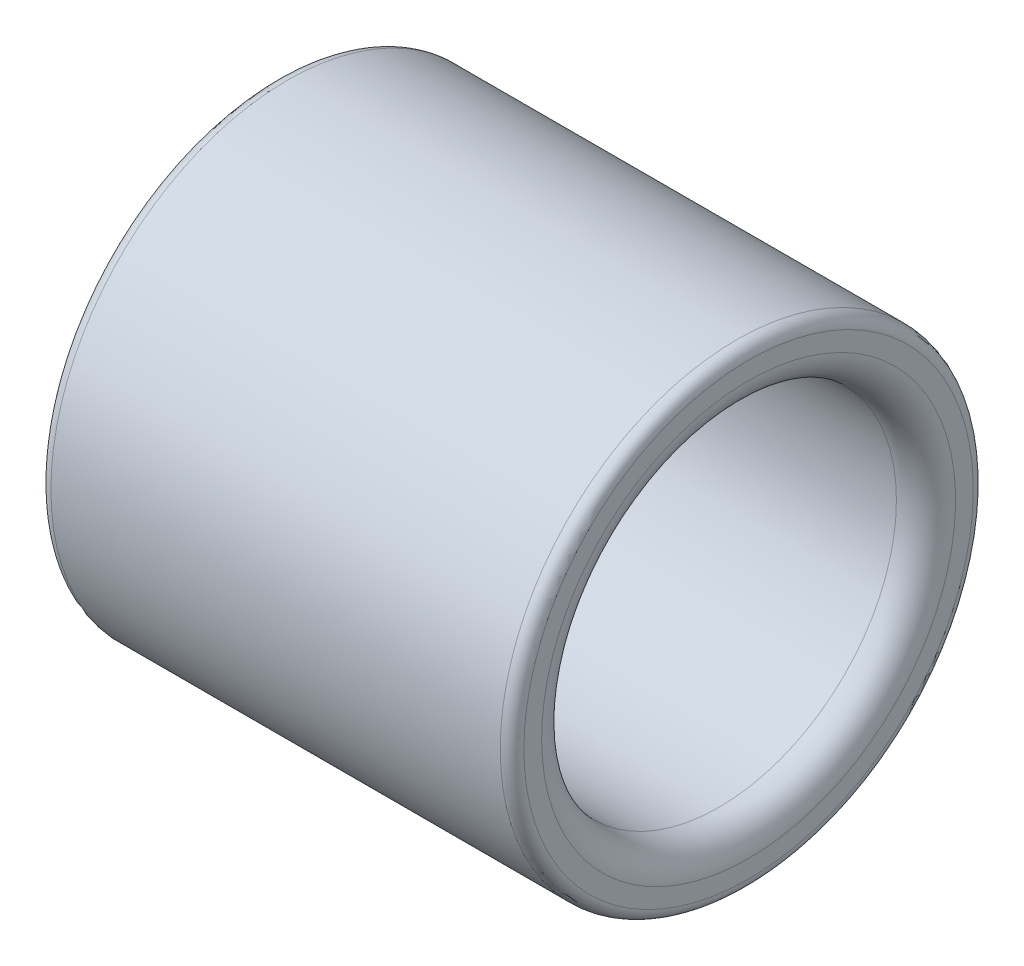
ISO-10303-21;
HEADER;
FILE_DESCRIPTION(('STEP AP214'),'2;1');
FILE_NAME('part.step','',(''),(''),'','','');
FILE_SCHEMA(('AUTOMOTIVE_DESIGN { 1 0 10303 214 1 1 1 1 }'));
ENDSEC;
DATA;
#1=APPLICATION_CONTEXT('core data for automotive mechanical design processes');
#2=APPLICATION_PROTOCOL_DEFINITION('international standard','automotive_design',2000,#1);
#3=PRODUCT_CONTEXT('',#1,'mechanical');
#4=PRODUCT('Part','Part','',(#3));
#5=PRODUCT_RELATED_PRODUCT_CATEGORY('part','',(#4));
#6=PRODUCT_DEFINITION_FORMATION('','',#4);
#7=PRODUCT_DEFINITION_CONTEXT('part definition',#1,'design');
#8=PRODUCT_DEFINITION('design','',#6,#7);
#9=PRODUCT_DEFINITION_SHAPE('','',#8);
#10=(LENGTH_UNIT() NAMED_UNIT(*) SI_UNIT(.MILLI.,.METRE.));
#11=(NAMED_UNIT(*) PLANE_ANGLE_UNIT() SI_UNIT($,.RADIAN.));
#12=(NAMED_UNIT(*) SI_UNIT($,.STERADIAN.) SOLID_ANGLE_UNIT());
#13=UNCERTAINTY_MEASURE_WITH_UNIT(LENGTH_MEASURE(1.E-05),#10,'distance_accuracy_value','');
#14=(GEOMETRIC_REPRESENTATION_CONTEXT(3) GLOBAL_UNCERTAINTY_ASSIGNED_CONTEXT((#13)) GLOBAL_UNIT_ASSIGNED_CONTEXT((#10,
#11,#12)) REPRESENTATION_CONTEXT('',''));
#15=CARTESIAN_POINT('',(0.,0.,0.));
#16=DIRECTION('',(0.,0.,1.));
#17=DIRECTION('',(1.,0.,0.));
#18=AXIS2_PLACEMENT_3D('',#15,#16,#17);
#19=CARTESIAN_POINT('',(0.,0.,0.));
#20=DIRECTION('',(-1.,0.,0.));
#21=DIRECTION('',(0.,0.,1.));
#22=AXIS2_PLACEMENT_3D('',#19,#20,#21);
#23=CYLINDRICAL_SURFACE('',#22,3.);
#24=CARTESIAN_POINT('',(7.5,0.,0.));
#25=DIRECTION('',(-1.,0.,0.));
#26=DIRECTION('',(0.,0.,1.));
#27=AXIS2_PLACEMENT_3D('',#24,#25,#26);
#28=CIRCLE('',#27,3.);
#29=CARTESIAN_POINT('',(7.5,0.,3.));
#30=VERTEX_POINT('',#29);
#31=EDGE_CURVE('E47',#30,#30,#28,.F.);
#32=ORIENTED_EDGE('',*,*,#31,.T.);
#33=EDGE_LOOP('',(#32));
#34=FACE_BOUND('',#33,.T.);
#35=CARTESIAN_POINT('',(0.5,0.,0.));
#36=DIRECTION('',(1.,0.,0.));
#37=DIRECTION('',(0.,0.,-1.));
#38=AXIS2_PLACEMENT_3D('',#35,#36,#37);
#39=CIRCLE('',#38,3.);
#40=CARTESIAN_POINT('',(0.5,0.,-3.));
#41=VERTEX_POINT('',#40);
#42=EDGE_CURVE('E51',#41,#41,#39,.F.);
#43=ORIENTED_EDGE('',*,*,#42,.T.);
#44=EDGE_LOOP('',(#43));
#45=FACE_BOUND('',#44,.T.);
#46=ADVANCED_FACE('F40',(#34,#45),#23,.F.);
#47=CARTESIAN_POINT('',(0.,3.,0.));
#48=DIRECTION('',(1.,0.,0.));
#49=DIRECTION('',(0.,0.,-1.));
#50=AXIS2_PLACEMENT_3D('',#47,#48,#49);
#51=PLANE('',#50);
#52=CARTESIAN_POINT('',(0.,0.,0.));
#53=DIRECTION('',(1.,0.,0.));
#54=DIRECTION('',(0.,0.,-1.));
#55=AXIS2_PLACEMENT_3D('',#52,#53,#54);
#56=CIRCLE('',#55,3.5);
#57=CARTESIAN_POINT('',(0.,0.,-3.5));
#58=VERTEX_POINT('',#57);
#59=EDGE_CURVE('E10',#58,#58,#56,.T.);
#60=ORIENTED_EDGE('',*,*,#59,.T.);
#61=EDGE_LOOP('',(#60));
#62=FACE_BOUND('',#61,.T.);
#63=CARTESIAN_POINT('',(0.,0.,0.));
#64=DIRECTION('',(1.,0.,0.));
#65=DIRECTION('',(0.,0.,-1.));
#66=AXIS2_PLACEMENT_3D('',#63,#64,#65);
#67=CIRCLE('',#66,3.8);
#68=CARTESIAN_POINT('',(0.,0.,-3.8));
#69=VERTEX_POINT('',#68);
#70=EDGE_CURVE('E60',#69,#69,#67,.F.);
#71=ORIENTED_EDGE('',*,*,#70,.T.);
#72=EDGE_LOOP('',(#71));
#73=FACE_BOUND('',#72,.T.);
#74=ADVANCED_FACE('F83',(#62,#73),#51,.F.);
#75=CARTESIAN_POINT('',(0.,0.,0.));
#76=DIRECTION('',(-1.,0.,0.));
#77=DIRECTION('',(0.,0.,1.));
#78=AXIS2_PLACEMENT_3D('',#75,#76,#77);
#79=CYLINDRICAL_SURFACE('',#78,4.);
#80=CARTESIAN_POINT('',(7.8,0.,0.));
#81=DIRECTION('',(-1.,0.,0.));
#82=DIRECTION('',(0.,0.,1.));
#83=AXIS2_PLACEMENT_3D('',#80,#81,#82);
#84=CIRCLE('',#83,4.);
#85=CARTESIAN_POINT('',(7.8,0.,4.));
#86=VERTEX_POINT('',#85);
#87=EDGE_CURVE('E66',#86,#86,#84,.T.);
#88=ORIENTED_EDGE('',*,*,#87,.T.);
#89=EDGE_LOOP('',(#88));
#90=FACE_BOUND('',#89,.T.);
#91=CARTESIAN_POINT('',(0.2,0.,0.));
#92=DIRECTION('',(1.,0.,0.));
#93=DIRECTION('',(0.,0.,-1.));
#94=AXIS2_PLACEMENT_3D('',#91,#92,#93);
#95=CIRCLE('',#94,4.);
#96=CARTESIAN_POINT('',(0.2,0.,-4.));
#97=VERTEX_POINT('',#96);
#98=EDGE_CURVE('E69',#97,#97,#95,.T.);
#99=ORIENTED_EDGE('',*,*,#98,.T.);
#100=EDGE_LOOP('',(#99));
#101=FACE_BOUND('',#100,.T.);
#102=ADVANCED_FACE('F73',(#90,#101),#79,.T.);
#103=CARTESIAN_POINT('',(8.,4.,0.));
#104=DIRECTION('',(-1.,0.,0.));
#105=DIRECTION('',(0.,0.,1.));
#106=AXIS2_PLACEMENT_3D('',#103,#104,#105);
#107=PLANE('',#106);
#108=CARTESIAN_POINT('',(8.,0.,0.));
#109=DIRECTION('',(-1.,0.,0.));
#110=DIRECTION('',(0.,0.,1.));
#111=AXIS2_PLACEMENT_3D('',#108,#109,#110);
#112=CIRCLE('',#111,3.5);
#113=CARTESIAN_POINT('',(8.,0.,3.5));
#114=VERTEX_POINT('',#113);
#115=EDGE_CURVE('E55',#114,#114,#112,.T.);
#116=ORIENTED_EDGE('',*,*,#115,.T.);
#117=EDGE_LOOP('',(#116));
#118=FACE_BOUND('',#117,.T.);
#119=CARTESIAN_POINT('',(8.,0.,0.));
#120=DIRECTION('',(-1.,0.,0.));
#121=DIRECTION('',(0.,0.,1.));
#122=AXIS2_PLACEMENT_3D('',#119,#120,#121);
#123=CIRCLE('',#122,3.8);
#124=CARTESIAN_POINT('',(8.,0.,3.8));
#125=VERTEX_POINT('',#124);
#126=EDGE_CURVE('E63',#125,#125,#123,.F.);
#127=ORIENTED_EDGE('',*,*,#126,.T.);
#128=EDGE_LOOP('',(#127));
#129=FACE_BOUND('',#128,.T.);
#130=ADVANCED_FACE('F90',(#118,#129),#107,.F.);
#131=CARTESIAN_POINT('',(7.8,0.,0.));
#132=DIRECTION('',(-1.,0.,0.));
#133=DIRECTION('',(0.,0.,1.));
#134=AXIS2_PLACEMENT_3D('',#131,#132,#133);
#135=TOROIDAL_SURFACE('',#134,3.8,0.2);
#136=ORIENTED_EDGE('',*,*,#126,.F.);
#137=EDGE_LOOP('',(#136));
#138=FACE_BOUND('',#137,.T.);
#139=ORIENTED_EDGE('',*,*,#87,.F.);
#140=EDGE_LOOP('',(#139));
#141=FACE_BOUND('',#140,.T.);
#142=ADVANCED_FACE('F79',(#138,#141),#135,.T.);
#143=CARTESIAN_POINT('',(0.2,0.,0.));
#144=DIRECTION('',(1.,0.,0.));
#145=DIRECTION('',(0.,0.,-1.));
#146=AXIS2_PLACEMENT_3D('',#143,#144,#145);
#147=TOROIDAL_SURFACE('',#146,3.8,0.2);
#148=ORIENTED_EDGE('',*,*,#98,.F.);
#149=EDGE_LOOP('',(#148));
#150=FACE_BOUND('',#149,.T.);
#151=ORIENTED_EDGE('',*,*,#70,.F.);
#152=EDGE_LOOP('',(#151));
#153=FACE_BOUND('',#152,.T.);
#154=ADVANCED_FACE('F75',(#150,#153),#147,.T.);
#155=CARTESIAN_POINT('',(7.5,0.,0.));
#156=DIRECTION('',(-1.,0.,0.));
#157=DIRECTION('',(0.,0.,1.));
#158=AXIS2_PLACEMENT_3D('',#155,#156,#157);
#159=TOROIDAL_SURFACE('',#158,3.5,0.5);
#160=ORIENTED_EDGE('',*,*,#31,.F.);
#161=EDGE_LOOP('',(#160));
#162=FACE_BOUND('',#161,.T.);
#163=ORIENTED_EDGE('',*,*,#115,.F.);
#164=EDGE_LOOP('',(#163));
#165=FACE_BOUND('',#164,.T.);
#166=ADVANCED_FACE('F78',(#162,#165),#159,.T.);
#167=CARTESIAN_POINT('',(0.5,0.,0.));
#168=DIRECTION('',(1.,0.,0.));
#169=DIRECTION('',(0.,0.,-1.));
#170=AXIS2_PLACEMENT_3D('',#167,#168,#169);
#171=TOROIDAL_SURFACE('',#170,3.5,0.5);
#172=ORIENTED_EDGE('',*,*,#59,.F.);
#173=EDGE_LOOP('',(#172));
#174=FACE_BOUND('',#173,.T.);
#175=ORIENTED_EDGE('',*,*,#42,.F.);
#176=EDGE_LOOP('',(#175));
#177=FACE_BOUND('',#176,.T.);
#178=ADVANCED_FACE('F42',(#174,#177),#171,.T.);
#179=CLOSED_SHELL('',(#46,#74,#102,#130,#142,#154,#166,#178));
#180=MANIFOLD_SOLID_BREP('B2',#179);
#181=ADVANCED_BREP_SHAPE_REPRESENTATION('',(#18,#180),#14);
#182=SHAPE_DEFINITION_REPRESENTATION(#9,#181);
ENDSEC;
END-ISO-10303-21;
